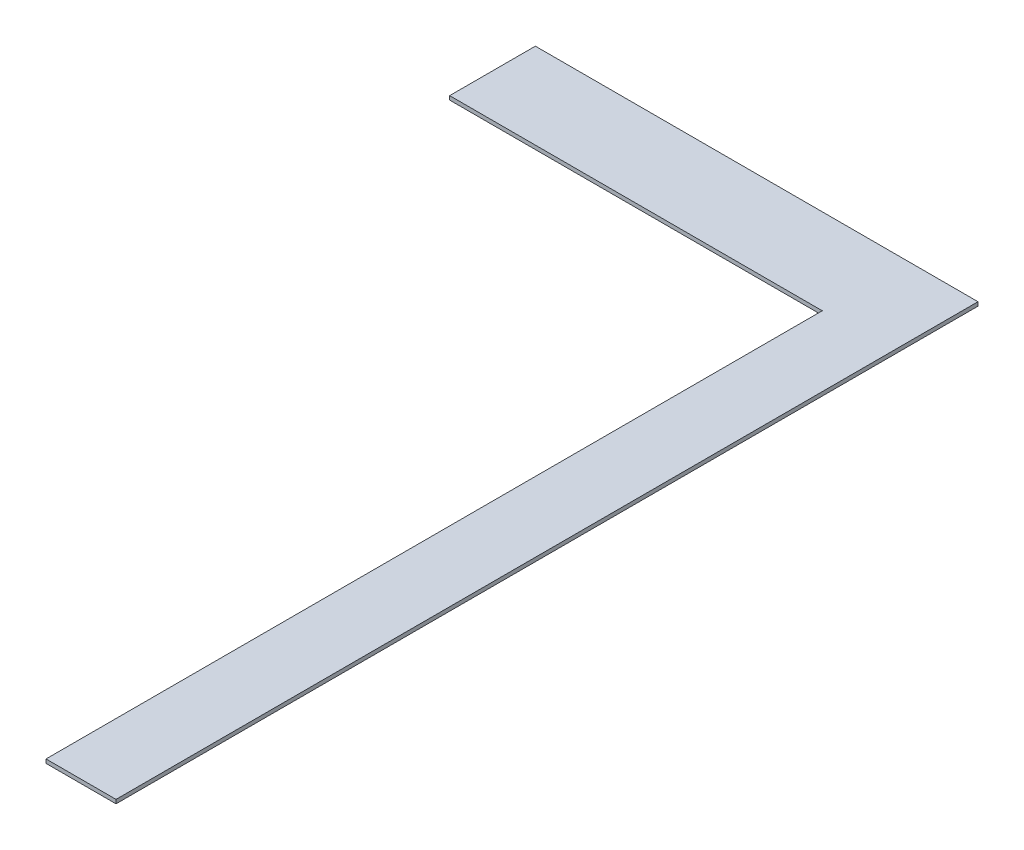
ISO-10303-21;
HEADER;
FILE_DESCRIPTION(('STEP AP214'),'2;1');
FILE_NAME('part.step','',(''),(''),'','','');
FILE_SCHEMA(('AUTOMOTIVE_DESIGN { 1 0 10303 214 1 1 1 1 }'));
ENDSEC;
DATA;
#1=APPLICATION_CONTEXT('core data for automotive mechanical design processes');
#2=APPLICATION_PROTOCOL_DEFINITION('international standard','automotive_design',2000,#1);
#3=PRODUCT_CONTEXT('',#1,'mechanical');
#4=PRODUCT('Part','Part','',(#3));
#5=PRODUCT_RELATED_PRODUCT_CATEGORY('part','',(#4));
#6=PRODUCT_DEFINITION_FORMATION('','',#4);
#7=PRODUCT_DEFINITION_CONTEXT('part definition',#1,'design');
#8=PRODUCT_DEFINITION('design','',#6,#7);
#9=PRODUCT_DEFINITION_SHAPE('','',#8);
#10=(LENGTH_UNIT() NAMED_UNIT(*) SI_UNIT(.MILLI.,.METRE.));
#11=(NAMED_UNIT(*) PLANE_ANGLE_UNIT() SI_UNIT($,.RADIAN.));
#12=(NAMED_UNIT(*) SI_UNIT($,.STERADIAN.) SOLID_ANGLE_UNIT());
#13=UNCERTAINTY_MEASURE_WITH_UNIT(LENGTH_MEASURE(1.E-05),#10,'distance_accuracy_value','');
#14=(GEOMETRIC_REPRESENTATION_CONTEXT(3) GLOBAL_UNCERTAINTY_ASSIGNED_CONTEXT((#13)) GLOBAL_UNIT_ASSIGNED_CONTEXT((#10,
#11,#12)) REPRESENTATION_CONTEXT('',''));
#15=CARTESIAN_POINT('',(0.,0.,0.));
#16=DIRECTION('',(0.,0.,1.));
#17=DIRECTION('',(1.,0.,0.));
#18=AXIS2_PLACEMENT_3D('',#15,#16,#17);
#19=CARTESIAN_POINT('',(-1425.5,-12.5,276.));
#20=DIRECTION('',(0.,0.,1.));
#21=DIRECTION('',(1.,0.,0.));
#22=AXIS2_PLACEMENT_3D('',#19,#20,#21);
#23=PLANE('',#22);
#24=DIRECTION('',(1.,0.,0.));
#25=VECTOR('',#24,1.);
#26=CARTESIAN_POINT('',(-1425.5,0.,276.));
#27=LINE('',#26,#25);
#28=CARTESIAN_POINT('',(-1425.5,0.,276.));
#29=VERTEX_POINT('',#28);
#30=CARTESIAN_POINT('',(-225.5,0.,276.));
#31=VERTEX_POINT('',#30);
#32=EDGE_CURVE('E120',#29,#31,#27,.T.);
#33=ORIENTED_EDGE('',*,*,#32,.F.);
#34=DIRECTION('',(0.,1.,0.));
#35=VECTOR('',#34,1.);
#36=CARTESIAN_POINT('',(-1425.5,-12.5,276.));
#37=LINE('',#36,#35);
#38=CARTESIAN_POINT('',(-1425.5,-12.5,276.));
#39=VERTEX_POINT('',#38);
#40=EDGE_CURVE('E11',#39,#29,#37,.T.);
#41=ORIENTED_EDGE('',*,*,#40,.F.);
#42=DIRECTION('',(1.,0.,0.));
#43=VECTOR('',#42,1.);
#44=CARTESIAN_POINT('',(-1425.5,-12.5,276.));
#45=LINE('',#44,#43);
#46=CARTESIAN_POINT('',(-225.5,-12.5,276.));
#47=VERTEX_POINT('',#46);
#48=EDGE_CURVE('E134',#39,#47,#45,.T.);
#49=ORIENTED_EDGE('',*,*,#48,.T.);
#50=DIRECTION('',(0.,1.,0.));
#51=VECTOR('',#50,1.);
#52=CARTESIAN_POINT('',(-225.5,-12.5,276.));
#53=LINE('',#52,#51);
#54=EDGE_CURVE('E38',#47,#31,#53,.T.);
#55=ORIENTED_EDGE('',*,*,#54,.T.);
#56=EDGE_LOOP('',(#33,#41,#49,#55));
#57=FACE_BOUND('',#56,.T.);
#58=ADVANCED_FACE('F35',(#57),#23,.T.);
#59=CARTESIAN_POINT('',(-1425.5,-12.5,276.));
#60=DIRECTION('',(-1.,0.,0.));
#61=DIRECTION('',(0.,0.,1.));
#62=AXIS2_PLACEMENT_3D('',#59,#60,#61);
#63=PLANE('',#62);
#64=DIRECTION('',(0.,0.,1.));
#65=VECTOR('',#64,1.);
#66=CARTESIAN_POINT('',(-1425.5,0.,276.));
#67=LINE('',#66,#65);
#68=CARTESIAN_POINT('',(-1425.5,0.,0.));
#69=VERTEX_POINT('',#68);
#70=EDGE_CURVE('E132',#69,#29,#67,.T.);
#71=ORIENTED_EDGE('',*,*,#70,.F.);
#72=DIRECTION('',(0.,1.,0.));
#73=VECTOR('',#72,1.);
#74=CARTESIAN_POINT('',(-1425.5,-12.5,0.));
#75=LINE('',#74,#73);
#76=CARTESIAN_POINT('',(-1425.5,-12.5,0.));
#77=VERTEX_POINT('',#76);
#78=EDGE_CURVE('E44',#77,#69,#75,.T.);
#79=ORIENTED_EDGE('',*,*,#78,.F.);
#80=DIRECTION('',(0.,0.,1.));
#81=VECTOR('',#80,1.);
#82=CARTESIAN_POINT('',(-1425.5,-12.5,276.));
#83=LINE('',#82,#81);
#84=EDGE_CURVE('E110',#77,#39,#83,.T.);
#85=ORIENTED_EDGE('',*,*,#84,.T.);
#86=ORIENTED_EDGE('',*,*,#40,.T.);
#87=EDGE_LOOP('',(#71,#79,#85,#86));
#88=FACE_BOUND('',#87,.T.);
#89=ADVANCED_FACE('F142',(#88),#63,.T.);
#90=CARTESIAN_POINT('',(-1425.5,-12.5,0.));
#91=DIRECTION('',(0.,0.,-1.));
#92=DIRECTION('',(-1.,0.,0.));
#93=AXIS2_PLACEMENT_3D('',#90,#91,#92);
#94=PLANE('',#93);
#95=DIRECTION('',(-1.,0.,0.));
#96=VECTOR('',#95,1.);
#97=CARTESIAN_POINT('',(-1425.5,0.,0.));
#98=LINE('',#97,#96);
#99=CARTESIAN_POINT('',(0.,0.,0.));
#100=VERTEX_POINT('',#99);
#101=EDGE_CURVE('E97',#100,#69,#98,.T.);
#102=ORIENTED_EDGE('',*,*,#101,.F.);
#103=DIRECTION('',(0.,1.,0.));
#104=VECTOR('',#103,1.);
#105=CARTESIAN_POINT('',(0.,-12.5,0.));
#106=LINE('',#105,#104);
#107=CARTESIAN_POINT('',(0.,-12.5,0.));
#108=VERTEX_POINT('',#107);
#109=EDGE_CURVE('E92',#108,#100,#106,.T.);
#110=ORIENTED_EDGE('',*,*,#109,.F.);
#111=DIRECTION('',(-1.,0.,0.));
#112=VECTOR('',#111,1.);
#113=CARTESIAN_POINT('',(-1425.5,-12.5,0.));
#114=LINE('',#113,#112);
#115=EDGE_CURVE('E95',#108,#77,#114,.T.);
#116=ORIENTED_EDGE('',*,*,#115,.T.);
#117=ORIENTED_EDGE('',*,*,#78,.T.);
#118=EDGE_LOOP('',(#102,#110,#116,#117));
#119=FACE_BOUND('',#118,.T.);
#120=ADVANCED_FACE('F94',(#119),#94,.T.);
#121=CARTESIAN_POINT('',(0.,-12.5,0.));
#122=DIRECTION('',(1.,0.,0.));
#123=DIRECTION('',(0.,0.,-1.));
#124=AXIS2_PLACEMENT_3D('',#121,#122,#123);
#125=PLANE('',#124);
#126=DIRECTION('',(0.,0.,-1.));
#127=VECTOR('',#126,1.);
#128=CARTESIAN_POINT('',(0.,0.,0.));
#129=LINE('',#128,#127);
#130=CARTESIAN_POINT('',(3.40005801291454E-13,0.,2776.));
#131=VERTEX_POINT('',#130);
#132=EDGE_CURVE('E129',#131,#100,#129,.T.);
#133=ORIENTED_EDGE('',*,*,#132,.F.);
#134=DIRECTION('',(0.,1.,0.));
#135=VECTOR('',#134,1.);
#136=CARTESIAN_POINT('',(3.40005801291454E-13,-12.5,2776.));
#137=LINE('',#136,#135);
#138=CARTESIAN_POINT('',(3.40005801291454E-13,-12.5,2776.));
#139=VERTEX_POINT('',#138);
#140=EDGE_CURVE('E102',#139,#131,#137,.T.);
#141=ORIENTED_EDGE('',*,*,#140,.F.);
#142=DIRECTION('',(0.,0.,-1.));
#143=VECTOR('',#142,1.);
#144=CARTESIAN_POINT('',(0.,-12.5,0.));
#145=LINE('',#144,#143);
#146=EDGE_CURVE('E108',#139,#108,#145,.T.);
#147=ORIENTED_EDGE('',*,*,#146,.T.);
#148=ORIENTED_EDGE('',*,*,#109,.T.);
#149=EDGE_LOOP('',(#133,#141,#147,#148));
#150=FACE_BOUND('',#149,.T.);
#151=ADVANCED_FACE('F112',(#150),#125,.T.);
#152=CARTESIAN_POINT('',(3.40005801291454E-13,-12.5,2776.));
#153=DIRECTION('',(0.,0.,1.));
#154=DIRECTION('',(1.,0.,0.));
#155=AXIS2_PLACEMENT_3D('',#152,#153,#154);
#156=PLANE('',#155);
#157=DIRECTION('',(1.,0.,0.));
#158=VECTOR('',#157,1.);
#159=CARTESIAN_POINT('',(3.40005801291454E-13,0.,2776.));
#160=LINE('',#159,#158);
#161=CARTESIAN_POINT('',(-225.5,0.,2776.));
#162=VERTEX_POINT('',#161);
#163=EDGE_CURVE('E126',#162,#131,#160,.T.);
#164=ORIENTED_EDGE('',*,*,#163,.F.);
#165=DIRECTION('',(0.,1.,0.));
#166=VECTOR('',#165,1.);
#167=CARTESIAN_POINT('',(-225.5,-12.5,2776.));
#168=LINE('',#167,#166);
#169=CARTESIAN_POINT('',(-225.5,-12.5,2776.));
#170=VERTEX_POINT('',#169);
#171=EDGE_CURVE('E137',#170,#162,#168,.T.);
#172=ORIENTED_EDGE('',*,*,#171,.F.);
#173=DIRECTION('',(1.,0.,0.));
#174=VECTOR('',#173,1.);
#175=CARTESIAN_POINT('',(3.40005801291454E-13,-12.5,2776.));
#176=LINE('',#175,#174);
#177=EDGE_CURVE('E113',#170,#139,#176,.T.);
#178=ORIENTED_EDGE('',*,*,#177,.T.);
#179=ORIENTED_EDGE('',*,*,#140,.T.);
#180=EDGE_LOOP('',(#164,#172,#178,#179));
#181=FACE_BOUND('',#180,.T.);
#182=ADVANCED_FACE('F155',(#181),#156,.T.);
#183=CARTESIAN_POINT('',(-225.5,-12.5,276.));
#184=DIRECTION('',(-1.,0.,0.));
#185=DIRECTION('',(0.,0.,1.));
#186=AXIS2_PLACEMENT_3D('',#183,#184,#185);
#187=PLANE('',#186);
#188=DIRECTION('',(0.,0.,1.));
#189=VECTOR('',#188,1.);
#190=CARTESIAN_POINT('',(-225.5,0.,276.));
#191=LINE('',#190,#189);
#192=EDGE_CURVE('E123',#31,#162,#191,.T.);
#193=ORIENTED_EDGE('',*,*,#192,.F.);
#194=ORIENTED_EDGE('',*,*,#54,.F.);
#195=DIRECTION('',(0.,0.,1.));
#196=VECTOR('',#195,1.);
#197=CARTESIAN_POINT('',(-225.5,-12.5,276.));
#198=LINE('',#197,#196);
#199=EDGE_CURVE('E115',#47,#170,#198,.T.);
#200=ORIENTED_EDGE('',*,*,#199,.T.);
#201=ORIENTED_EDGE('',*,*,#171,.T.);
#202=EDGE_LOOP('',(#193,#194,#200,#201));
#203=FACE_BOUND('',#202,.T.);
#204=ADVANCED_FACE('F139',(#203),#187,.T.);
#205=CARTESIAN_POINT('',(0.,-12.5,0.));
#206=DIRECTION('',(0.,-1.,0.));
#207=DIRECTION('',(0.,0.,-1.));
#208=AXIS2_PLACEMENT_3D('',#205,#206,#207);
#209=PLANE('',#208);
#210=ORIENTED_EDGE('',*,*,#48,.F.);
#211=ORIENTED_EDGE('',*,*,#84,.F.);
#212=ORIENTED_EDGE('',*,*,#115,.F.);
#213=ORIENTED_EDGE('',*,*,#146,.F.);
#214=ORIENTED_EDGE('',*,*,#177,.F.);
#215=ORIENTED_EDGE('',*,*,#199,.F.);
#216=EDGE_LOOP('',(#210,#211,#212,#213,#214,#215));
#217=FACE_BOUND('',#216,.T.);
#218=ADVANCED_FACE('F106',(#217),#209,.T.);
#219=CARTESIAN_POINT('',(0.,0.,0.));
#220=DIRECTION('',(0.,-1.,0.));
#221=DIRECTION('',(0.,0.,-1.));
#222=AXIS2_PLACEMENT_3D('',#219,#220,#221);
#223=PLANE('',#222);
#224=ORIENTED_EDGE('',*,*,#32,.T.);
#225=ORIENTED_EDGE('',*,*,#192,.T.);
#226=ORIENTED_EDGE('',*,*,#163,.T.);
#227=ORIENTED_EDGE('',*,*,#132,.T.);
#228=ORIENTED_EDGE('',*,*,#101,.T.);
#229=ORIENTED_EDGE('',*,*,#70,.T.);
#230=EDGE_LOOP('',(#224,#225,#226,#227,#228,#229));
#231=FACE_BOUND('',#230,.T.);
#232=ADVANCED_FACE('F141',(#231),#223,.F.);
#233=CLOSED_SHELL('',(#58,#89,#120,#151,#182,#204,#218,#232));
#234=MANIFOLD_SOLID_BREP('B2',#233);
#235=ADVANCED_BREP_SHAPE_REPRESENTATION('',(#18,#234),#14);
#236=SHAPE_DEFINITION_REPRESENTATION(#9,#235);
ENDSEC;
END-ISO-10303-21;
